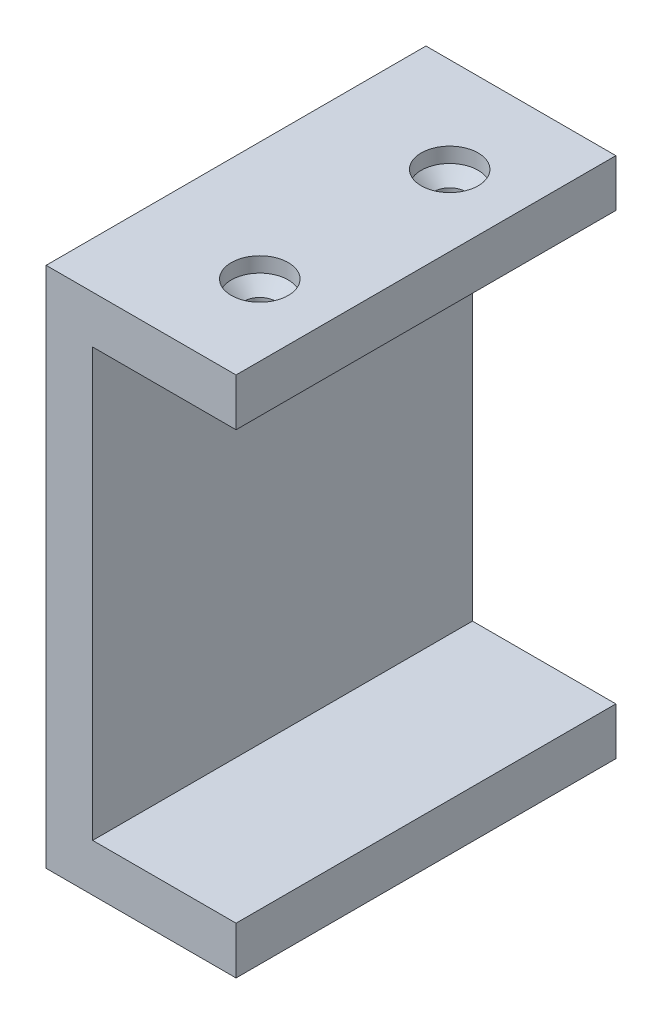
ISO-10303-21;
HEADER;
FILE_DESCRIPTION(('STEP AP214'),'2;1');
FILE_NAME('part.step','',(''),(''),'','','');
FILE_SCHEMA(('AUTOMOTIVE_DESIGN { 1 0 10303 214 1 1 1 1 }'));
ENDSEC;
DATA;
#1=APPLICATION_CONTEXT('core data for automotive mechanical design processes');
#2=APPLICATION_PROTOCOL_DEFINITION('international standard','automotive_design',2000,#1);
#3=PRODUCT_CONTEXT('',#1,'mechanical');
#4=PRODUCT('Part','Part','',(#3));
#5=PRODUCT_RELATED_PRODUCT_CATEGORY('part','',(#4));
#6=PRODUCT_DEFINITION_FORMATION('','',#4);
#7=PRODUCT_DEFINITION_CONTEXT('part definition',#1,'design');
#8=PRODUCT_DEFINITION('design','',#6,#7);
#9=PRODUCT_DEFINITION_SHAPE('','',#8);
#10=(LENGTH_UNIT() NAMED_UNIT(*) SI_UNIT(.MILLI.,.METRE.));
#11=(NAMED_UNIT(*) PLANE_ANGLE_UNIT() SI_UNIT($,.RADIAN.));
#12=(NAMED_UNIT(*) SI_UNIT($,.STERADIAN.) SOLID_ANGLE_UNIT());
#13=UNCERTAINTY_MEASURE_WITH_UNIT(LENGTH_MEASURE(1.E-05),#10,'distance_accuracy_value','');
#14=(GEOMETRIC_REPRESENTATION_CONTEXT(3) GLOBAL_UNCERTAINTY_ASSIGNED_CONTEXT((#13)) GLOBAL_UNIT_ASSIGNED_CONTEXT((#10,
#11,#12)) REPRESENTATION_CONTEXT('',''));
#15=CARTESIAN_POINT('',(0.,0.,0.));
#16=DIRECTION('',(0.,0.,1.));
#17=DIRECTION('',(1.,0.,0.));
#18=AXIS2_PLACEMENT_3D('',#15,#16,#17);
#19=CARTESIAN_POINT('',(0.,5.,-10.));
#20=DIRECTION('',(0.,-1.,0.));
#21=DIRECTION('',(0.,0.,-1.));
#22=AXIS2_PLACEMENT_3D('',#19,#20,#21);
#23=CYLINDRICAL_SURFACE('',#22,3.);
#24=CARTESIAN_POINT('',(0.,5.,-10.));
#25=DIRECTION('',(0.,-1.,0.));
#26=DIRECTION('',(0.,0.,-1.));
#27=AXIS2_PLACEMENT_3D('',#24,#25,#26);
#28=CIRCLE('',#27,3.);
#29=CARTESIAN_POINT('',(0.,5.,-13.));
#30=VERTEX_POINT('',#29);
#31=EDGE_CURVE('E151',#30,#30,#28,.T.);
#32=ORIENTED_EDGE('',*,*,#31,.F.);
#33=EDGE_LOOP('',(#32));
#34=FACE_BOUND('',#33,.T.);
#35=CARTESIAN_POINT('',(0.,3.41499999999988,-10.));
#36=DIRECTION('',(0.,1.,0.));
#37=DIRECTION('',(0.,0.,1.));
#38=AXIS2_PLACEMENT_3D('',#35,#36,#37);
#39=CIRCLE('',#38,3.);
#40=CARTESIAN_POINT('',(0.,3.41499999999988,-7.));
#41=VERTEX_POINT('',#40);
#42=EDGE_CURVE('E11',#41,#41,#39,.T.);
#43=ORIENTED_EDGE('',*,*,#42,.F.);
#44=EDGE_LOOP('',(#43));
#45=FACE_BOUND('',#44,.T.);
#46=ADVANCED_FACE('F39',(#34,#45),#23,.F.);
#47=CARTESIAN_POINT('',(0.,5.,10.));
#48=DIRECTION('',(0.,-1.,0.));
#49=DIRECTION('',(0.,0.,-1.));
#50=AXIS2_PLACEMENT_3D('',#47,#48,#49);
#51=CYLINDRICAL_SURFACE('',#50,3.);
#52=CARTESIAN_POINT('',(0.,5.,10.));
#53=DIRECTION('',(0.,-1.,0.));
#54=DIRECTION('',(0.,0.,1.));
#55=AXIS2_PLACEMENT_3D('',#52,#53,#54);
#56=CIRCLE('',#55,3.);
#57=CARTESIAN_POINT('',(0.,5.,13.));
#58=VERTEX_POINT('',#57);
#59=EDGE_CURVE('E143',#58,#58,#56,.T.);
#60=ORIENTED_EDGE('',*,*,#59,.F.);
#61=EDGE_LOOP('',(#60));
#62=FACE_BOUND('',#61,.T.);
#63=CARTESIAN_POINT('',(0.,3.41499999999988,10.));
#64=DIRECTION('',(0.,1.,0.));
#65=DIRECTION('',(0.,0.,1.));
#66=AXIS2_PLACEMENT_3D('',#63,#64,#65);
#67=CIRCLE('',#66,3.);
#68=CARTESIAN_POINT('',(0.,3.41499999999988,13.));
#69=VERTEX_POINT('',#68);
#70=EDGE_CURVE('E47',#69,#69,#67,.T.);
#71=ORIENTED_EDGE('',*,*,#70,.F.);
#72=EDGE_LOOP('',(#71));
#73=FACE_BOUND('',#72,.T.);
#74=ADVANCED_FACE('F184',(#62,#73),#51,.F.);
#75=CARTESIAN_POINT('',(-7.5,5.,20.));
#76=DIRECTION('',(0.,0.,-1.));
#77=DIRECTION('',(-1.,0.,0.));
#78=AXIS2_PLACEMENT_3D('',#75,#76,#77);
#79=PLANE('',#78);
#80=DIRECTION('',(0.,-1.,0.));
#81=VECTOR('',#80,1.);
#82=CARTESIAN_POINT('',(-12.5,5.,20.));
#83=LINE('',#82,#81);
#84=CARTESIAN_POINT('',(-12.5,5.,20.));
#85=VERTEX_POINT('',#84);
#86=CARTESIAN_POINT('',(-12.5,-50.,20.));
#87=VERTEX_POINT('',#86);
#88=EDGE_CURVE('E122',#85,#87,#83,.T.);
#89=ORIENTED_EDGE('',*,*,#88,.T.);
#90=DIRECTION('',(-1.,0.,0.));
#91=VECTOR('',#90,1.);
#92=CARTESIAN_POINT('',(-12.5,-50.,20.));
#93=LINE('',#92,#91);
#94=CARTESIAN_POINT('',(7.50000000000001,-50.,20.));
#95=VERTEX_POINT('',#94);
#96=EDGE_CURVE('E136',#95,#87,#93,.T.);
#97=ORIENTED_EDGE('',*,*,#96,.F.);
#98=DIRECTION('',(0.,1.,0.));
#99=VECTOR('',#98,1.);
#100=CARTESIAN_POINT('',(7.50000000000001,-50.,20.));
#101=LINE('',#100,#99);
#102=CARTESIAN_POINT('',(7.50000000000001,-45.,20.));
#103=VERTEX_POINT('',#102);
#104=EDGE_CURVE('E148',#95,#103,#101,.T.);
#105=ORIENTED_EDGE('',*,*,#104,.T.);
#106=DIRECTION('',(-1.,0.,0.));
#107=VECTOR('',#106,1.);
#108=CARTESIAN_POINT('',(-12.5,-45.,20.));
#109=LINE('',#108,#107);
#110=CARTESIAN_POINT('',(-7.6,-45.,20.));
#111=VERTEX_POINT('',#110);
#112=EDGE_CURVE('E137',#103,#111,#109,.T.);
#113=ORIENTED_EDGE('',*,*,#112,.T.);
#114=DIRECTION('',(0.,1.,0.));
#115=VECTOR('',#114,1.);
#116=CARTESIAN_POINT('',(-7.6,-45.,20.));
#117=LINE('',#116,#115);
#118=CARTESIAN_POINT('',(-7.6,0.,20.));
#119=VERTEX_POINT('',#118);
#120=EDGE_CURVE('E160',#111,#119,#117,.T.);
#121=ORIENTED_EDGE('',*,*,#120,.T.);
#122=DIRECTION('',(1.,0.,0.));
#123=VECTOR('',#122,1.);
#124=CARTESIAN_POINT('',(-7.5,0.,20.));
#125=LINE('',#124,#123);
#126=CARTESIAN_POINT('',(7.50000000000001,0.,20.));
#127=VERTEX_POINT('',#126);
#128=EDGE_CURVE('E162',#119,#127,#125,.T.);
#129=ORIENTED_EDGE('',*,*,#128,.T.);
#130=DIRECTION('',(0.,-1.,0.));
#131=VECTOR('',#130,1.);
#132=CARTESIAN_POINT('',(7.50000000000001,5.,20.));
#133=LINE('',#132,#131);
#134=CARTESIAN_POINT('',(7.50000000000001,5.,20.));
#135=VERTEX_POINT('',#134);
#136=EDGE_CURVE('E177',#135,#127,#133,.T.);
#137=ORIENTED_EDGE('',*,*,#136,.F.);
#138=DIRECTION('',(1.,0.,0.));
#139=VECTOR('',#138,1.);
#140=CARTESIAN_POINT('',(-7.5,5.,20.));
#141=LINE('',#140,#139);
#142=EDGE_CURVE('E83',#85,#135,#141,.T.);
#143=ORIENTED_EDGE('',*,*,#142,.F.);
#144=EDGE_LOOP('',(#89,#97,#105,#113,#121,#129,#137,#143));
#145=FACE_BOUND('',#144,.T.);
#146=ADVANCED_FACE('F41',(#145),#79,.F.);
#147=CARTESIAN_POINT('',(7.50000000000001,5.,20.));
#148=DIRECTION('',(-1.,0.,0.));
#149=DIRECTION('',(0.,0.,1.));
#150=AXIS2_PLACEMENT_3D('',#147,#148,#149);
#151=PLANE('',#150);
#152=DIRECTION('',(0.,0.,-1.));
#153=VECTOR('',#152,1.);
#154=CARTESIAN_POINT('',(7.50000000000001,0.,20.));
#155=LINE('',#154,#153);
#156=CARTESIAN_POINT('',(7.5,0.,-20.));
#157=VERTEX_POINT('',#156);
#158=EDGE_CURVE('E171',#127,#157,#155,.T.);
#159=ORIENTED_EDGE('',*,*,#158,.T.);
#160=DIRECTION('',(0.,-1.,0.));
#161=VECTOR('',#160,1.);
#162=CARTESIAN_POINT('',(7.5,5.,-20.));
#163=LINE('',#162,#161);
#164=CARTESIAN_POINT('',(7.5,5.,-20.));
#165=VERTEX_POINT('',#164);
#166=EDGE_CURVE('E121',#165,#157,#163,.T.);
#167=ORIENTED_EDGE('',*,*,#166,.F.);
#168=DIRECTION('',(0.,0.,-1.));
#169=VECTOR('',#168,1.);
#170=CARTESIAN_POINT('',(7.50000000000001,5.,20.));
#171=LINE('',#170,#169);
#172=EDGE_CURVE('E165',#135,#165,#171,.T.);
#173=ORIENTED_EDGE('',*,*,#172,.F.);
#174=ORIENTED_EDGE('',*,*,#136,.T.);
#175=EDGE_LOOP('',(#159,#167,#173,#174));
#176=FACE_BOUND('',#175,.T.);
#177=ADVANCED_FACE('F193',(#176),#151,.F.);
#178=CARTESIAN_POINT('',(-12.5,5.,-20.));
#179=DIRECTION('',(0.,0.,1.));
#180=DIRECTION('',(1.,0.,0.));
#181=AXIS2_PLACEMENT_3D('',#178,#179,#180);
#182=PLANE('',#181);
#183=DIRECTION('',(-1.,0.,0.));
#184=VECTOR('',#183,1.);
#185=CARTESIAN_POINT('',(-12.5,0.,-20.));
#186=LINE('',#185,#184);
#187=CARTESIAN_POINT('',(-7.6,0.,-20.));
#188=VERTEX_POINT('',#187);
#189=EDGE_CURVE('E78',#157,#188,#186,.T.);
#190=ORIENTED_EDGE('',*,*,#189,.T.);
#191=DIRECTION('',(0.,1.,0.));
#192=VECTOR('',#191,1.);
#193=CARTESIAN_POINT('',(-7.60000000000001,-45.,-20.));
#194=LINE('',#193,#192);
#195=CARTESIAN_POINT('',(-7.60000000000001,-45.,-20.));
#196=VERTEX_POINT('',#195);
#197=EDGE_CURVE('E54',#196,#188,#194,.T.);
#198=ORIENTED_EDGE('',*,*,#197,.F.);
#199=DIRECTION('',(1.,0.,0.));
#200=VECTOR('',#199,1.);
#201=CARTESIAN_POINT('',(-12.5,-45.,-20.));
#202=LINE('',#201,#200);
#203=CARTESIAN_POINT('',(7.50000000000001,-45.,-20.));
#204=VERTEX_POINT('',#203);
#205=EDGE_CURVE('E149',#196,#204,#202,.T.);
#206=ORIENTED_EDGE('',*,*,#205,.T.);
#207=DIRECTION('',(0.,1.,0.));
#208=VECTOR('',#207,1.);
#209=CARTESIAN_POINT('',(7.50000000000001,-50.,-20.));
#210=LINE('',#209,#208);
#211=CARTESIAN_POINT('',(7.50000000000001,-50.,-20.));
#212=VERTEX_POINT('',#211);
#213=EDGE_CURVE('E128',#212,#204,#210,.T.);
#214=ORIENTED_EDGE('',*,*,#213,.F.);
#215=DIRECTION('',(1.,0.,0.));
#216=VECTOR('',#215,1.);
#217=CARTESIAN_POINT('',(-12.5,-50.,-20.));
#218=LINE('',#217,#216);
#219=CARTESIAN_POINT('',(-12.5,-50.,-20.));
#220=VERTEX_POINT('',#219);
#221=EDGE_CURVE('E125',#220,#212,#218,.T.);
#222=ORIENTED_EDGE('',*,*,#221,.F.);
#223=DIRECTION('',(0.,-1.,0.));
#224=VECTOR('',#223,1.);
#225=CARTESIAN_POINT('',(-12.5,5.,-20.));
#226=LINE('',#225,#224);
#227=CARTESIAN_POINT('',(-12.5,5.,-20.));
#228=VERTEX_POINT('',#227);
#229=EDGE_CURVE('E114',#228,#220,#226,.T.);
#230=ORIENTED_EDGE('',*,*,#229,.F.);
#231=DIRECTION('',(-1.,0.,0.));
#232=VECTOR('',#231,1.);
#233=CARTESIAN_POINT('',(-7.50000000000001,5.,-20.));
#234=LINE('',#233,#232);
#235=EDGE_CURVE('E167',#165,#228,#234,.T.);
#236=ORIENTED_EDGE('',*,*,#235,.F.);
#237=ORIENTED_EDGE('',*,*,#166,.T.);
#238=EDGE_LOOP('',(#190,#198,#206,#214,#222,#230,#236,#237));
#239=FACE_BOUND('',#238,.T.);
#240=ADVANCED_FACE('F126',(#239),#182,.F.);
#241=CARTESIAN_POINT('',(-12.5,5.,-20.));
#242=DIRECTION('',(1.,0.,0.));
#243=DIRECTION('',(0.,0.,-1.));
#244=AXIS2_PLACEMENT_3D('',#241,#242,#243);
#245=PLANE('',#244);
#246=ORIENTED_EDGE('',*,*,#229,.T.);
#247=DIRECTION('',(0.,0.,-1.));
#248=VECTOR('',#247,1.);
#249=CARTESIAN_POINT('',(-12.5,-50.,-20.));
#250=LINE('',#249,#248);
#251=EDGE_CURVE('E118',#87,#220,#250,.T.);
#252=ORIENTED_EDGE('',*,*,#251,.F.);
#253=ORIENTED_EDGE('',*,*,#88,.F.);
#254=DIRECTION('',(0.,0.,1.));
#255=VECTOR('',#254,1.);
#256=CARTESIAN_POINT('',(-12.5,5.,-20.));
#257=LINE('',#256,#255);
#258=EDGE_CURVE('E63',#228,#85,#257,.T.);
#259=ORIENTED_EDGE('',*,*,#258,.F.);
#260=EDGE_LOOP('',(#246,#252,#253,#259));
#261=FACE_BOUND('',#260,.T.);
#262=ADVANCED_FACE('F116',(#261),#245,.F.);
#263=CARTESIAN_POINT('',(0.,5.,0.));
#264=DIRECTION('',(0.,1.,0.));
#265=DIRECTION('',(0.,0.,1.));
#266=AXIS2_PLACEMENT_3D('',#263,#264,#265);
#267=PLANE('',#266);
#268=ORIENTED_EDGE('',*,*,#31,.T.);
#269=EDGE_LOOP('',(#268));
#270=FACE_BOUND('',#269,.T.);
#271=ORIENTED_EDGE('',*,*,#59,.T.);
#272=EDGE_LOOP('',(#271));
#273=FACE_BOUND('',#272,.T.);
#274=ORIENTED_EDGE('',*,*,#142,.T.);
#275=ORIENTED_EDGE('',*,*,#172,.T.);
#276=ORIENTED_EDGE('',*,*,#235,.T.);
#277=ORIENTED_EDGE('',*,*,#258,.T.);
#278=EDGE_LOOP('',(#274,#275,#276,#277));
#279=FACE_BOUND('',#278,.T.);
#280=ADVANCED_FACE('F215',(#270,#273,#279),#267,.T.);
#281=CARTESIAN_POINT('',(0.,0.,0.));
#282=DIRECTION('',(0.,1.,0.));
#283=DIRECTION('',(0.,0.,1.));
#284=AXIS2_PLACEMENT_3D('',#281,#282,#283);
#285=PLANE('',#284);
#286=ORIENTED_EDGE('',*,*,#128,.F.);
#287=DIRECTION('',(0.,0.,-1.));
#288=VECTOR('',#287,1.);
#289=CARTESIAN_POINT('',(-7.60000000000001,0.,-20.));
#290=LINE('',#289,#288);
#291=EDGE_CURVE('E156',#119,#188,#290,.T.);
#292=ORIENTED_EDGE('',*,*,#291,.T.);
#293=ORIENTED_EDGE('',*,*,#189,.F.);
#294=ORIENTED_EDGE('',*,*,#158,.F.);
#295=EDGE_LOOP('',(#286,#292,#293,#294));
#296=FACE_BOUND('',#295,.T.);
#297=CARTESIAN_POINT('',(0.,0.,10.));
#298=DIRECTION('',(0.,1.,0.));
#299=DIRECTION('',(0.,0.,1.));
#300=AXIS2_PLACEMENT_3D('',#297,#298,#299);
#301=CIRCLE('',#300,1.70000000000012);
#302=CARTESIAN_POINT('',(0.,0.,11.7000000000001));
#303=VERTEX_POINT('',#302);
#304=EDGE_CURVE('E238',#303,#303,#301,.T.);
#305=ORIENTED_EDGE('',*,*,#304,.T.);
#306=EDGE_LOOP('',(#305));
#307=FACE_BOUND('',#306,.T.);
#308=CARTESIAN_POINT('',(0.,0.,-10.));
#309=DIRECTION('',(0.,-1.,0.));
#310=DIRECTION('',(0.,0.,-1.));
#311=AXIS2_PLACEMENT_3D('',#308,#309,#310);
#312=CIRCLE('',#311,1.70000000000012);
#313=CARTESIAN_POINT('',(0.,0.,-11.7000000000001));
#314=VERTEX_POINT('',#313);
#315=EDGE_CURVE('E241',#314,#314,#312,.T.);
#316=ORIENTED_EDGE('',*,*,#315,.F.);
#317=EDGE_LOOP('',(#316));
#318=FACE_BOUND('',#317,.T.);
#319=ADVANCED_FACE('F214',(#296,#307,#318),#285,.F.);
#320=CARTESIAN_POINT('',(-7.60000000000001,-45.,-20.));
#321=DIRECTION('',(1.,0.,0.));
#322=DIRECTION('',(0.,0.,-1.));
#323=AXIS2_PLACEMENT_3D('',#320,#321,#322);
#324=PLANE('',#323);
#325=ORIENTED_EDGE('',*,*,#291,.F.);
#326=ORIENTED_EDGE('',*,*,#120,.F.);
#327=DIRECTION('',(0.,0.,-1.));
#328=VECTOR('',#327,1.);
#329=CARTESIAN_POINT('',(-7.60000000000001,-45.,-20.));
#330=LINE('',#329,#328);
#331=EDGE_CURVE('E157',#111,#196,#330,.T.);
#332=ORIENTED_EDGE('',*,*,#331,.T.);
#333=ORIENTED_EDGE('',*,*,#197,.T.);
#334=EDGE_LOOP('',(#325,#326,#332,#333));
#335=FACE_BOUND('',#334,.T.);
#336=ADVANCED_FACE('F207',(#335),#324,.T.);
#337=CARTESIAN_POINT('',(0.,-45.,0.));
#338=DIRECTION('',(0.,1.,0.));
#339=DIRECTION('',(0.,0.,1.));
#340=AXIS2_PLACEMENT_3D('',#337,#338,#339);
#341=PLANE('',#340);
#342=ORIENTED_EDGE('',*,*,#331,.F.);
#343=ORIENTED_EDGE('',*,*,#112,.F.);
#344=DIRECTION('',(0.,0.,1.));
#345=VECTOR('',#344,1.);
#346=CARTESIAN_POINT('',(7.50000000000001,-45.,-20.));
#347=LINE('',#346,#345);
#348=EDGE_CURVE('E140',#204,#103,#347,.T.);
#349=ORIENTED_EDGE('',*,*,#348,.F.);
#350=ORIENTED_EDGE('',*,*,#205,.F.);
#351=EDGE_LOOP('',(#342,#343,#349,#350));
#352=FACE_BOUND('',#351,.T.);
#353=ADVANCED_FACE('F204',(#352),#341,.T.);
#354=CARTESIAN_POINT('',(7.50000000000001,-50.,-20.));
#355=DIRECTION('',(-1.,0.,0.));
#356=DIRECTION('',(0.,0.,1.));
#357=AXIS2_PLACEMENT_3D('',#354,#355,#356);
#358=PLANE('',#357);
#359=ORIENTED_EDGE('',*,*,#348,.T.);
#360=ORIENTED_EDGE('',*,*,#104,.F.);
#361=DIRECTION('',(0.,0.,1.));
#362=VECTOR('',#361,1.);
#363=CARTESIAN_POINT('',(7.50000000000001,-50.,-20.));
#364=LINE('',#363,#362);
#365=EDGE_CURVE('E131',#212,#95,#364,.T.);
#366=ORIENTED_EDGE('',*,*,#365,.F.);
#367=ORIENTED_EDGE('',*,*,#213,.T.);
#368=EDGE_LOOP('',(#359,#360,#366,#367));
#369=FACE_BOUND('',#368,.T.);
#370=ADVANCED_FACE('F203',(#369),#358,.F.);
#371=CARTESIAN_POINT('',(0.,-50.,0.));
#372=DIRECTION('',(0.,1.,0.));
#373=DIRECTION('',(0.,0.,1.));
#374=AXIS2_PLACEMENT_3D('',#371,#372,#373);
#375=PLANE('',#374);
#376=ORIENTED_EDGE('',*,*,#251,.T.);
#377=ORIENTED_EDGE('',*,*,#221,.T.);
#378=ORIENTED_EDGE('',*,*,#365,.T.);
#379=ORIENTED_EDGE('',*,*,#96,.T.);
#380=EDGE_LOOP('',(#376,#377,#378,#379));
#381=FACE_BOUND('',#380,.T.);
#382=ADVANCED_FACE('F134',(#381),#375,.F.);
#383=CARTESIAN_POINT('',(0.,3.415,10.));
#384=DIRECTION('',(0.,1.,0.));
#385=DIRECTION('',(0.,0.,1.));
#386=AXIS2_PLACEMENT_3D('',#383,#384,#385);
#387=CONICAL_SURFACE('',#386,3.00000000000013,0.785398163397446);
#388=CARTESIAN_POINT('',(0.,2.11499999999999,10.));
#389=DIRECTION('',(0.,1.,0.));
#390=DIRECTION('',(0.,0.,1.));
#391=AXIS2_PLACEMENT_3D('',#388,#389,#390);
#392=CIRCLE('',#391,1.70000000000012);
#393=CARTESIAN_POINT('',(0.,2.11499999999999,11.7000000000001));
#394=VERTEX_POINT('',#393);
#395=EDGE_CURVE('E249',#394,#394,#392,.T.);
#396=ORIENTED_EDGE('',*,*,#395,.F.);
#397=EDGE_LOOP('',(#396));
#398=FACE_BOUND('',#397,.T.);
#399=ORIENTED_EDGE('',*,*,#70,.T.);
#400=EDGE_LOOP('',(#399));
#401=FACE_BOUND('',#400,.T.);
#402=ADVANCED_FACE('F182',(#398,#401),#387,.F.);
#403=CARTESIAN_POINT('',(0.,5.,10.));
#404=DIRECTION('',(0.,1.,0.));
#405=DIRECTION('',(0.,0.,1.));
#406=AXIS2_PLACEMENT_3D('',#403,#404,#405);
#407=CYLINDRICAL_SURFACE('',#406,1.70000000000012);
#408=ORIENTED_EDGE('',*,*,#304,.F.);
#409=EDGE_LOOP('',(#408));
#410=FACE_BOUND('',#409,.T.);
#411=ORIENTED_EDGE('',*,*,#395,.T.);
#412=EDGE_LOOP('',(#411));
#413=FACE_BOUND('',#412,.T.);
#414=ADVANCED_FACE('F261',(#410,#413),#407,.F.);
#415=CARTESIAN_POINT('',(0.,3.415,-10.));
#416=DIRECTION('',(0.,1.,0.));
#417=DIRECTION('',(0.,0.,-1.));
#418=AXIS2_PLACEMENT_3D('',#415,#416,#417);
#419=CONICAL_SURFACE('',#418,3.00000000000013,0.785398163397446);
#420=CARTESIAN_POINT('',(0.,2.11499999999999,-10.));
#421=DIRECTION('',(0.,-1.,0.));
#422=DIRECTION('',(0.,0.,-1.));
#423=AXIS2_PLACEMENT_3D('',#420,#421,#422);
#424=CIRCLE('',#423,1.70000000000012);
#425=CARTESIAN_POINT('',(0.,2.11499999999999,-11.7000000000001));
#426=VERTEX_POINT('',#425);
#427=EDGE_CURVE('E243',#426,#426,#424,.T.);
#428=ORIENTED_EDGE('',*,*,#427,.T.);
#429=EDGE_LOOP('',(#428));
#430=FACE_BOUND('',#429,.T.);
#431=ORIENTED_EDGE('',*,*,#42,.T.);
#432=EDGE_LOOP('',(#431));
#433=FACE_BOUND('',#432,.T.);
#434=ADVANCED_FACE('F258',(#430,#433),#419,.F.);
#435=CARTESIAN_POINT('',(0.,5.,-10.));
#436=DIRECTION('',(0.,1.,0.));
#437=DIRECTION('',(0.,0.,-1.));
#438=AXIS2_PLACEMENT_3D('',#435,#436,#437);
#439=CYLINDRICAL_SURFACE('',#438,1.70000000000012);
#440=ORIENTED_EDGE('',*,*,#315,.T.);
#441=EDGE_LOOP('',(#440));
#442=FACE_BOUND('',#441,.T.);
#443=ORIENTED_EDGE('',*,*,#427,.F.);
#444=EDGE_LOOP('',(#443));
#445=FACE_BOUND('',#444,.T.);
#446=ADVANCED_FACE('F260',(#442,#445),#439,.F.);
#447=CLOSED_SHELL('',(#46,#74,#146,#177,#240,#262,#280,#319,#336,#353,#370,#382,#402,#414,#434,#446));
#448=MANIFOLD_SOLID_BREP('B2',#447);
#449=ADVANCED_BREP_SHAPE_REPRESENTATION('',(#18,#448),#14);
#450=SHAPE_DEFINITION_REPRESENTATION(#9,#449);
ENDSEC;
END-ISO-10303-21;
